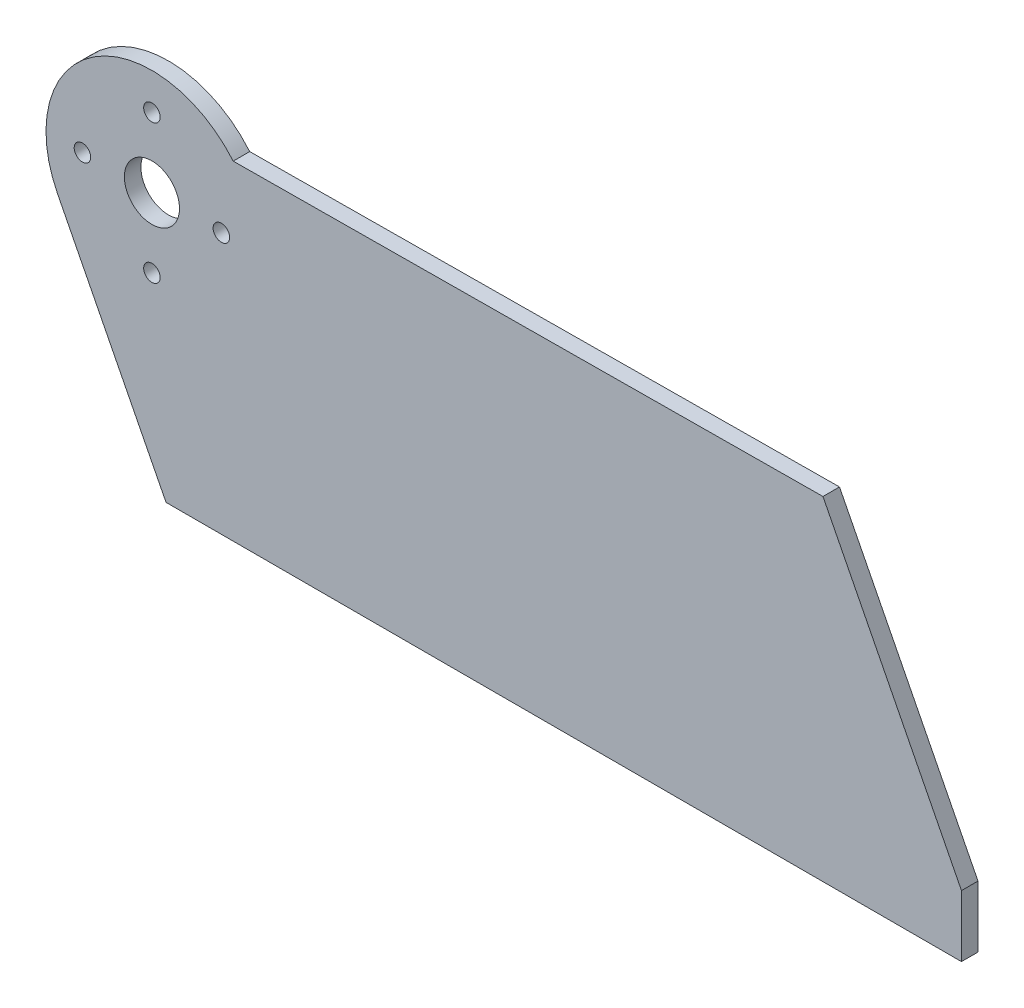
ISO-10303-21;
HEADER;
FILE_DESCRIPTION(('STEP AP214'),'2;1');
FILE_NAME('part.step','',(''),(''),'','','');
FILE_SCHEMA(('AUTOMOTIVE_DESIGN { 1 0 10303 214 1 1 1 1 }'));
ENDSEC;
DATA;
#1=APPLICATION_CONTEXT('core data for automotive mechanical design processes');
#2=APPLICATION_PROTOCOL_DEFINITION('international standard','automotive_design',2000,#1);
#3=PRODUCT_CONTEXT('',#1,'mechanical');
#4=PRODUCT('Part','Part','',(#3));
#5=PRODUCT_RELATED_PRODUCT_CATEGORY('part','',(#4));
#6=PRODUCT_DEFINITION_FORMATION('','',#4);
#7=PRODUCT_DEFINITION_CONTEXT('part definition',#1,'design');
#8=PRODUCT_DEFINITION('design','',#6,#7);
#9=PRODUCT_DEFINITION_SHAPE('','',#8);
#10=(LENGTH_UNIT() NAMED_UNIT(*) SI_UNIT(.MILLI.,.METRE.));
#11=(NAMED_UNIT(*) PLANE_ANGLE_UNIT() SI_UNIT($,.RADIAN.));
#12=(NAMED_UNIT(*) SI_UNIT($,.STERADIAN.) SOLID_ANGLE_UNIT());
#13=UNCERTAINTY_MEASURE_WITH_UNIT(LENGTH_MEASURE(1.E-05),#10,'distance_accuracy_value','');
#14=(GEOMETRIC_REPRESENTATION_CONTEXT(3) GLOBAL_UNCERTAINTY_ASSIGNED_CONTEXT((#13)) GLOBAL_UNIT_ASSIGNED_CONTEXT((#10,
#11,#12)) REPRESENTATION_CONTEXT('',''));
#15=CARTESIAN_POINT('',(0.,0.,0.));
#16=DIRECTION('',(0.,0.,1.));
#17=DIRECTION('',(1.,0.,0.));
#18=AXIS2_PLACEMENT_3D('',#15,#16,#17);
#19=CARTESIAN_POINT('',(0.,0.,3.));
#20=DIRECTION('',(0.,0.,1.));
#21=DIRECTION('',(1.,0.,0.));
#22=AXIS2_PLACEMENT_3D('',#19,#20,#21);
#23=PLANE('',#22);
#24=CARTESIAN_POINT('',(-12.6095009584965,0.,3.));
#25=DIRECTION('',(0.,0.,1.));
#26=DIRECTION('',(1.,0.,0.));
#27=AXIS2_PLACEMENT_3D('',#24,#25,#26);
#28=CIRCLE('',#27,1.5);
#29=CARTESIAN_POINT('',(-11.1095009584965,0.,3.));
#30=VERTEX_POINT('',#29);
#31=EDGE_CURVE('E192',#30,#30,#28,.T.);
#32=ORIENTED_EDGE('',*,*,#31,.F.);
#33=EDGE_LOOP('',(#32));
#34=FACE_BOUND('',#33,.T.);
#35=CARTESIAN_POINT('',(12.6095009584965,0.,3.));
#36=DIRECTION('',(0.,0.,1.));
#37=DIRECTION('',(1.,0.,0.));
#38=AXIS2_PLACEMENT_3D('',#35,#36,#37);
#39=CIRCLE('',#38,1.5);
#40=CARTESIAN_POINT('',(14.1095009584965,0.,3.));
#41=VERTEX_POINT('',#40);
#42=EDGE_CURVE('E204',#41,#41,#39,.T.);
#43=ORIENTED_EDGE('',*,*,#42,.F.);
#44=EDGE_LOOP('',(#43));
#45=FACE_BOUND('',#44,.T.);
#46=DIRECTION('',(0.453736962939517,-0.891135662209982,0.));
#47=VECTOR('',#46,1.);
#48=CARTESIAN_POINT('',(-17.1361795555129,-8.72517888984736,3.));
#49=LINE('',#48,#47);
#50=CARTESIAN_POINT('',(-17.1361795555129,-8.72517888984735,3.));
#51=VERTEX_POINT('',#50);
#52=CARTESIAN_POINT('',(2.56173210209496,-47.4117153259278,3.));
#53=VERTEX_POINT('',#52);
#54=EDGE_CURVE('E127',#51,#53,#49,.T.);
#55=ORIENTED_EDGE('',*,*,#54,.T.);
#56=DIRECTION('',(1.,0.,0.));
#57=VECTOR('',#56,1.);
#58=CARTESIAN_POINT('',(2.56173210209496,-47.4117153259278,3.));
#59=LINE('',#58,#57);
#60=CARTESIAN_POINT('',(146.959411549214,-47.4117153259278,3.));
#61=VERTEX_POINT('',#60);
#62=EDGE_CURVE('E85',#53,#61,#59,.T.);
#63=ORIENTED_EDGE('',*,*,#62,.T.);
#64=DIRECTION('',(0.,1.,0.));
#65=VECTOR('',#64,1.);
#66=CARTESIAN_POINT('',(146.959411549214,-47.4117153259278,3.));
#67=LINE('',#66,#65);
#68=CARTESIAN_POINT('',(146.959411549214,-36.2420393504318,3.));
#69=VERTEX_POINT('',#68);
#70=EDGE_CURVE('E98',#61,#69,#67,.T.);
#71=ORIENTED_EDGE('',*,*,#70,.T.);
#72=DIRECTION('',(-0.453706772332048,0.891151033630122,0.));
#73=VECTOR('',#72,1.);
#74=CARTESIAN_POINT('',(121.815327095741,13.144873556384,3.));
#75=LINE('',#74,#73);
#76=CARTESIAN_POINT('',(121.815327095741,13.144873556384,3.));
#77=VERTEX_POINT('',#76);
#78=EDGE_CURVE('E92',#69,#77,#75,.T.);
#79=ORIENTED_EDGE('',*,*,#78,.T.);
#80=DIRECTION('',(-0.999971302683561,-0.00757587020361484,0.));
#81=VECTOR('',#80,1.);
#82=CARTESIAN_POINT('',(121.815327095741,13.144873556384,3.));
#83=LINE('',#82,#81);
#84=CARTESIAN_POINT('',(14.7531600385174,12.3337611982928,3.));
#85=VERTEX_POINT('',#84);
#86=EDGE_CURVE('E96',#77,#85,#83,.T.);
#87=ORIENTED_EDGE('',*,*,#86,.T.);
#88=CARTESIAN_POINT('',(0.,0.,3.));
#89=DIRECTION('',(0.,0.,1.));
#90=DIRECTION('',(1.,0.,0.));
#91=AXIS2_PLACEMENT_3D('',#88,#89,#90);
#92=CIRCLE('',#91,19.2295968865345);
#93=EDGE_CURVE('E48',#85,#51,#92,.T.);
#94=ORIENTED_EDGE('',*,*,#93,.T.);
#95=EDGE_LOOP('',(#55,#63,#71,#79,#87,#94));
#96=FACE_BOUND('',#95,.T.);
#97=CARTESIAN_POINT('',(0.,0.,3.));
#98=DIRECTION('',(0.,0.,1.));
#99=DIRECTION('',(1.,0.,0.));
#100=AXIS2_PLACEMENT_3D('',#97,#98,#99);
#101=CIRCLE('',#100,5.);
#102=CARTESIAN_POINT('',(5.,0.,3.));
#103=VERTEX_POINT('',#102);
#104=EDGE_CURVE('E120',#103,#103,#101,.T.);
#105=ORIENTED_EDGE('',*,*,#104,.F.);
#106=EDGE_LOOP('',(#105));
#107=FACE_BOUND('',#106,.T.);
#108=CARTESIAN_POINT('',(0.,-12.6095009584965,3.));
#109=DIRECTION('',(0.,0.,1.));
#110=DIRECTION('',(1.,0.,0.));
#111=AXIS2_PLACEMENT_3D('',#108,#109,#110);
#112=CIRCLE('',#111,1.5);
#113=CARTESIAN_POINT('',(1.49999999999995,-12.6095009584965,3.));
#114=VERTEX_POINT('',#113);
#115=EDGE_CURVE('E198',#114,#114,#112,.T.);
#116=ORIENTED_EDGE('',*,*,#115,.F.);
#117=EDGE_LOOP('',(#116));
#118=FACE_BOUND('',#117,.T.);
#119=CARTESIAN_POINT('',(1.3207758836545E-13,12.6095009584965,3.));
#120=DIRECTION('',(0.,0.,1.));
#121=DIRECTION('',(1.,0.,0.));
#122=AXIS2_PLACEMENT_3D('',#119,#120,#121);
#123=CIRCLE('',#122,1.5);
#124=CARTESIAN_POINT('',(1.50000000000013,12.6095009584965,3.));
#125=VERTEX_POINT('',#124);
#126=EDGE_CURVE('E183',#125,#125,#123,.T.);
#127=ORIENTED_EDGE('',*,*,#126,.F.);
#128=EDGE_LOOP('',(#127));
#129=FACE_BOUND('',#128,.T.);
#130=ADVANCED_FACE('F31',(#34,#45,#96,#107,#118,#129),#23,.T.);
#131=CARTESIAN_POINT('',(0.,0.,0.));
#132=DIRECTION('',(0.,0.,1.));
#133=DIRECTION('',(1.,0.,0.));
#134=AXIS2_PLACEMENT_3D('',#131,#132,#133);
#135=PLANE('',#134);
#136=CARTESIAN_POINT('',(-12.6095009584965,0.,0.));
#137=DIRECTION('',(0.,0.,1.));
#138=DIRECTION('',(1.,0.,0.));
#139=AXIS2_PLACEMENT_3D('',#136,#137,#138);
#140=CIRCLE('',#139,1.5);
#141=CARTESIAN_POINT('',(-11.1095009584965,0.,0.));
#142=VERTEX_POINT('',#141);
#143=EDGE_CURVE('E189',#142,#142,#140,.T.);
#144=ORIENTED_EDGE('',*,*,#143,.T.);
#145=EDGE_LOOP('',(#144));
#146=FACE_BOUND('',#145,.T.);
#147=CARTESIAN_POINT('',(12.6095009584965,0.,0.));
#148=DIRECTION('',(0.,0.,1.));
#149=DIRECTION('',(1.,0.,0.));
#150=AXIS2_PLACEMENT_3D('',#147,#148,#149);
#151=CIRCLE('',#150,1.5);
#152=CARTESIAN_POINT('',(14.1095009584965,0.,0.));
#153=VERTEX_POINT('',#152);
#154=EDGE_CURVE('E201',#153,#153,#151,.T.);
#155=ORIENTED_EDGE('',*,*,#154,.T.);
#156=EDGE_LOOP('',(#155));
#157=FACE_BOUND('',#156,.T.);
#158=DIRECTION('',(0.453736962939517,-0.891135662209982,0.));
#159=VECTOR('',#158,1.);
#160=CARTESIAN_POINT('',(-17.1361795555129,-8.72517888984736,0.));
#161=LINE('',#160,#159);
#162=CARTESIAN_POINT('',(-17.1361795555129,-8.72517888984735,0.));
#163=VERTEX_POINT('',#162);
#164=CARTESIAN_POINT('',(2.56173210209496,-47.4117153259278,0.));
#165=VERTEX_POINT('',#164);
#166=EDGE_CURVE('E116',#163,#165,#161,.T.);
#167=ORIENTED_EDGE('',*,*,#166,.F.);
#168=CARTESIAN_POINT('',(0.,0.,0.));
#169=DIRECTION('',(0.,0.,1.));
#170=DIRECTION('',(1.,0.,0.));
#171=AXIS2_PLACEMENT_3D('',#168,#169,#170);
#172=CIRCLE('',#171,19.2295968865345);
#173=CARTESIAN_POINT('',(14.7531600385174,12.3337611982928,0.));
#174=VERTEX_POINT('',#173);
#175=EDGE_CURVE('E77',#174,#163,#172,.T.);
#176=ORIENTED_EDGE('',*,*,#175,.F.);
#177=DIRECTION('',(-0.999971302683561,-0.00757587020361484,0.));
#178=VECTOR('',#177,1.);
#179=CARTESIAN_POINT('',(121.815327095741,13.144873556384,0.));
#180=LINE('',#179,#178);
#181=CARTESIAN_POINT('',(121.815327095741,13.144873556384,0.));
#182=VERTEX_POINT('',#181);
#183=EDGE_CURVE('E71',#182,#174,#180,.T.);
#184=ORIENTED_EDGE('',*,*,#183,.F.);
#185=DIRECTION('',(-0.453706772332048,0.891151033630122,0.));
#186=VECTOR('',#185,1.);
#187=CARTESIAN_POINT('',(121.815327095741,13.144873556384,0.));
#188=LINE('',#187,#186);
#189=CARTESIAN_POINT('',(146.959411549214,-36.2420393504318,0.));
#190=VERTEX_POINT('',#189);
#191=EDGE_CURVE('E106',#190,#182,#188,.T.);
#192=ORIENTED_EDGE('',*,*,#191,.F.);
#193=DIRECTION('',(0.,1.,0.));
#194=VECTOR('',#193,1.);
#195=CARTESIAN_POINT('',(146.959411549214,-47.4117153259278,0.));
#196=LINE('',#195,#194);
#197=CARTESIAN_POINT('',(146.959411549214,-47.4117153259278,0.));
#198=VERTEX_POINT('',#197);
#199=EDGE_CURVE('E122',#198,#190,#196,.T.);
#200=ORIENTED_EDGE('',*,*,#199,.F.);
#201=DIRECTION('',(1.,0.,0.));
#202=VECTOR('',#201,1.);
#203=CARTESIAN_POINT('',(2.56173210209496,-47.4117153259278,0.));
#204=LINE('',#203,#202);
#205=EDGE_CURVE('E119',#165,#198,#204,.T.);
#206=ORIENTED_EDGE('',*,*,#205,.F.);
#207=EDGE_LOOP('',(#167,#176,#184,#192,#200,#206));
#208=FACE_BOUND('',#207,.T.);
#209=CARTESIAN_POINT('',(0.,0.,0.));
#210=DIRECTION('',(0.,0.,1.));
#211=DIRECTION('',(1.,0.,0.));
#212=AXIS2_PLACEMENT_3D('',#209,#210,#211);
#213=CIRCLE('',#212,5.);
#214=CARTESIAN_POINT('',(5.,0.,0.));
#215=VERTEX_POINT('',#214);
#216=EDGE_CURVE('E207',#215,#215,#213,.T.);
#217=ORIENTED_EDGE('',*,*,#216,.T.);
#218=EDGE_LOOP('',(#217));
#219=FACE_BOUND('',#218,.T.);
#220=CARTESIAN_POINT('',(0.,-12.6095009584965,0.));
#221=DIRECTION('',(0.,0.,1.));
#222=DIRECTION('',(1.,0.,0.));
#223=AXIS2_PLACEMENT_3D('',#220,#221,#222);
#224=CIRCLE('',#223,1.5);
#225=CARTESIAN_POINT('',(1.49999999999995,-12.6095009584965,0.));
#226=VERTEX_POINT('',#225);
#227=EDGE_CURVE('E195',#226,#226,#224,.T.);
#228=ORIENTED_EDGE('',*,*,#227,.T.);
#229=EDGE_LOOP('',(#228));
#230=FACE_BOUND('',#229,.T.);
#231=CARTESIAN_POINT('',(1.3207758836545E-13,12.6095009584965,0.));
#232=DIRECTION('',(0.,0.,1.));
#233=DIRECTION('',(1.,0.,0.));
#234=AXIS2_PLACEMENT_3D('',#231,#232,#233);
#235=CIRCLE('',#234,1.5);
#236=CARTESIAN_POINT('',(1.50000000000013,12.6095009584965,0.));
#237=VERTEX_POINT('',#236);
#238=EDGE_CURVE('E186',#237,#237,#235,.T.);
#239=ORIENTED_EDGE('',*,*,#238,.T.);
#240=EDGE_LOOP('',(#239));
#241=FACE_BOUND('',#240,.T.);
#242=ADVANCED_FACE('F136',(#146,#157,#208,#219,#230,#241),#135,.F.);
#243=CARTESIAN_POINT('',(-17.1361795555129,-8.72517888984736,3.));
#244=DIRECTION('',(0.891135662209982,0.453736962939517,0.));
#245=DIRECTION('',(-0.453736962939517,0.891135662209982,0.));
#246=AXIS2_PLACEMENT_3D('',#243,#244,#245);
#247=PLANE('',#246);
#248=ORIENTED_EDGE('',*,*,#166,.T.);
#249=DIRECTION('',(0.,0.,-1.));
#250=VECTOR('',#249,1.);
#251=CARTESIAN_POINT('',(2.56173210209496,-47.4117153259278,3.));
#252=LINE('',#251,#250);
#253=EDGE_CURVE('E11',#53,#165,#252,.T.);
#254=ORIENTED_EDGE('',*,*,#253,.F.);
#255=ORIENTED_EDGE('',*,*,#54,.F.);
#256=DIRECTION('',(0.,0.,-1.));
#257=VECTOR('',#256,1.);
#258=CARTESIAN_POINT('',(-17.1361795555129,-8.72517888984735,3.));
#259=LINE('',#258,#257);
#260=EDGE_CURVE('E112',#51,#163,#259,.T.);
#261=ORIENTED_EDGE('',*,*,#260,.T.);
#262=EDGE_LOOP('',(#248,#254,#255,#261));
#263=FACE_BOUND('',#262,.T.);
#264=ADVANCED_FACE('F33',(#263),#247,.F.);
#265=CARTESIAN_POINT('',(2.56173210209496,-47.4117153259278,3.));
#266=DIRECTION('',(0.,1.,0.));
#267=DIRECTION('',(0.,0.,1.));
#268=AXIS2_PLACEMENT_3D('',#265,#266,#267);
#269=PLANE('',#268);
#270=ORIENTED_EDGE('',*,*,#205,.T.);
#271=DIRECTION('',(0.,0.,-1.));
#272=VECTOR('',#271,1.);
#273=CARTESIAN_POINT('',(146.959411549214,-47.4117153259278,3.));
#274=LINE('',#273,#272);
#275=EDGE_CURVE('E40',#61,#198,#274,.T.);
#276=ORIENTED_EDGE('',*,*,#275,.F.);
#277=ORIENTED_EDGE('',*,*,#62,.F.);
#278=ORIENTED_EDGE('',*,*,#253,.T.);
#279=EDGE_LOOP('',(#270,#276,#277,#278));
#280=FACE_BOUND('',#279,.T.);
#281=ADVANCED_FACE('F273',(#280),#269,.F.);
#282=CARTESIAN_POINT('',(146.959411549214,-47.4117153259278,3.));
#283=DIRECTION('',(-1.,0.,0.));
#284=DIRECTION('',(0.,0.,1.));
#285=AXIS2_PLACEMENT_3D('',#282,#283,#284);
#286=PLANE('',#285);
#287=ORIENTED_EDGE('',*,*,#199,.T.);
#288=DIRECTION('',(0.,0.,-1.));
#289=VECTOR('',#288,1.);
#290=CARTESIAN_POINT('',(146.959411549214,-36.2420393504318,3.));
#291=LINE('',#290,#289);
#292=EDGE_CURVE('E107',#69,#190,#291,.T.);
#293=ORIENTED_EDGE('',*,*,#292,.F.);
#294=ORIENTED_EDGE('',*,*,#70,.F.);
#295=ORIENTED_EDGE('',*,*,#275,.T.);
#296=EDGE_LOOP('',(#287,#293,#294,#295));
#297=FACE_BOUND('',#296,.T.);
#298=ADVANCED_FACE('F133',(#297),#286,.F.);
#299=CARTESIAN_POINT('',(121.815327095741,13.144873556384,3.));
#300=DIRECTION('',(-0.891151033630122,-0.453706772332048,0.));
#301=DIRECTION('',(0.453706772332048,-0.891151033630122,0.));
#302=AXIS2_PLACEMENT_3D('',#299,#300,#301);
#303=PLANE('',#302);
#304=ORIENTED_EDGE('',*,*,#191,.T.);
#305=DIRECTION('',(0.,0.,-1.));
#306=VECTOR('',#305,1.);
#307=CARTESIAN_POINT('',(121.815327095741,13.144873556384,3.));
#308=LINE('',#307,#306);
#309=EDGE_CURVE('E103',#77,#182,#308,.T.);
#310=ORIENTED_EDGE('',*,*,#309,.F.);
#311=ORIENTED_EDGE('',*,*,#78,.F.);
#312=ORIENTED_EDGE('',*,*,#292,.T.);
#313=EDGE_LOOP('',(#304,#310,#311,#312));
#314=FACE_BOUND('',#313,.T.);
#315=ADVANCED_FACE('F104',(#314),#303,.F.);
#316=CARTESIAN_POINT('',(121.815327095741,13.144873556384,3.));
#317=DIRECTION('',(0.00757587020361484,-0.999971302683561,0.));
#318=DIRECTION('',(0.999971302683561,0.00757587020361484,0.));
#319=AXIS2_PLACEMENT_3D('',#316,#317,#318);
#320=PLANE('',#319);
#321=ORIENTED_EDGE('',*,*,#183,.T.);
#322=DIRECTION('',(0.,0.,-1.));
#323=VECTOR('',#322,1.);
#324=CARTESIAN_POINT('',(14.7531600385174,12.3337611982928,3.));
#325=LINE('',#324,#323);
#326=EDGE_CURVE('E108',#85,#174,#325,.T.);
#327=ORIENTED_EDGE('',*,*,#326,.F.);
#328=ORIENTED_EDGE('',*,*,#86,.F.);
#329=ORIENTED_EDGE('',*,*,#309,.T.);
#330=EDGE_LOOP('',(#321,#327,#328,#329));
#331=FACE_BOUND('',#330,.T.);
#332=ADVANCED_FACE('F110',(#331),#320,.F.);
#333=CARTESIAN_POINT('',(0.,0.,3.));
#334=DIRECTION('',(0.,0.,-1.));
#335=DIRECTION('',(-1.,0.,0.));
#336=AXIS2_PLACEMENT_3D('',#333,#334,#335);
#337=CYLINDRICAL_SURFACE('',#336,19.2295968865345);
#338=ORIENTED_EDGE('',*,*,#175,.T.);
#339=ORIENTED_EDGE('',*,*,#260,.F.);
#340=ORIENTED_EDGE('',*,*,#93,.F.);
#341=ORIENTED_EDGE('',*,*,#326,.T.);
#342=EDGE_LOOP('',(#338,#339,#340,#341));
#343=FACE_BOUND('',#342,.T.);
#344=ADVANCED_FACE('F141',(#343),#337,.T.);
#345=CARTESIAN_POINT('',(0.,0.,3.));
#346=DIRECTION('',(0.,0.,-1.));
#347=DIRECTION('',(-1.,0.,0.));
#348=AXIS2_PLACEMENT_3D('',#345,#346,#347);
#349=CYLINDRICAL_SURFACE('',#348,5.);
#350=ORIENTED_EDGE('',*,*,#104,.T.);
#351=EDGE_LOOP('',(#350));
#352=FACE_BOUND('',#351,.T.);
#353=ORIENTED_EDGE('',*,*,#216,.F.);
#354=EDGE_LOOP('',(#353));
#355=FACE_BOUND('',#354,.T.);
#356=ADVANCED_FACE('F143',(#352,#355),#349,.F.);
#357=CARTESIAN_POINT('',(12.6095009584965,0.,3.));
#358=DIRECTION('',(0.,0.,-1.));
#359=DIRECTION('',(-1.,0.,0.));
#360=AXIS2_PLACEMENT_3D('',#357,#358,#359);
#361=CYLINDRICAL_SURFACE('',#360,1.5);
#362=ORIENTED_EDGE('',*,*,#42,.T.);
#363=EDGE_LOOP('',(#362));
#364=FACE_BOUND('',#363,.T.);
#365=ORIENTED_EDGE('',*,*,#154,.F.);
#366=EDGE_LOOP('',(#365));
#367=FACE_BOUND('',#366,.T.);
#368=ADVANCED_FACE('F149',(#364,#367),#361,.F.);
#369=CARTESIAN_POINT('',(0.,-12.6095009584965,3.));
#370=DIRECTION('',(0.,0.,-1.));
#371=DIRECTION('',(-1.,0.,0.));
#372=AXIS2_PLACEMENT_3D('',#369,#370,#371);
#373=CYLINDRICAL_SURFACE('',#372,1.5);
#374=ORIENTED_EDGE('',*,*,#115,.T.);
#375=EDGE_LOOP('',(#374));
#376=FACE_BOUND('',#375,.T.);
#377=ORIENTED_EDGE('',*,*,#227,.F.);
#378=EDGE_LOOP('',(#377));
#379=FACE_BOUND('',#378,.T.);
#380=ADVANCED_FACE('F166',(#376,#379),#373,.F.);
#381=CARTESIAN_POINT('',(-12.6095009584965,0.,3.));
#382=DIRECTION('',(0.,0.,-1.));
#383=DIRECTION('',(-1.,0.,0.));
#384=AXIS2_PLACEMENT_3D('',#381,#382,#383);
#385=CYLINDRICAL_SURFACE('',#384,1.5);
#386=ORIENTED_EDGE('',*,*,#31,.T.);
#387=EDGE_LOOP('',(#386));
#388=FACE_BOUND('',#387,.T.);
#389=ORIENTED_EDGE('',*,*,#143,.F.);
#390=EDGE_LOOP('',(#389));
#391=FACE_BOUND('',#390,.T.);
#392=ADVANCED_FACE('F170',(#388,#391),#385,.F.);
#393=CARTESIAN_POINT('',(1.3207758836545E-13,12.6095009584965,3.));
#394=DIRECTION('',(0.,0.,-1.));
#395=DIRECTION('',(-1.,0.,0.));
#396=AXIS2_PLACEMENT_3D('',#393,#394,#395);
#397=CYLINDRICAL_SURFACE('',#396,1.5);
#398=ORIENTED_EDGE('',*,*,#126,.T.);
#399=EDGE_LOOP('',(#398));
#400=FACE_BOUND('',#399,.T.);
#401=ORIENTED_EDGE('',*,*,#238,.F.);
#402=EDGE_LOOP('',(#401));
#403=FACE_BOUND('',#402,.T.);
#404=ADVANCED_FACE('F174',(#400,#403),#397,.F.);
#405=CLOSED_SHELL('',(#130,#242,#264,#281,#298,#315,#332,#344,#356,#368,#380,#392,#404));
#406=MANIFOLD_SOLID_BREP('B2',#405);
#407=ADVANCED_BREP_SHAPE_REPRESENTATION('',(#18,#406),#14);
#408=SHAPE_DEFINITION_REPRESENTATION(#9,#407);
ENDSEC;
END-ISO-10303-21;
